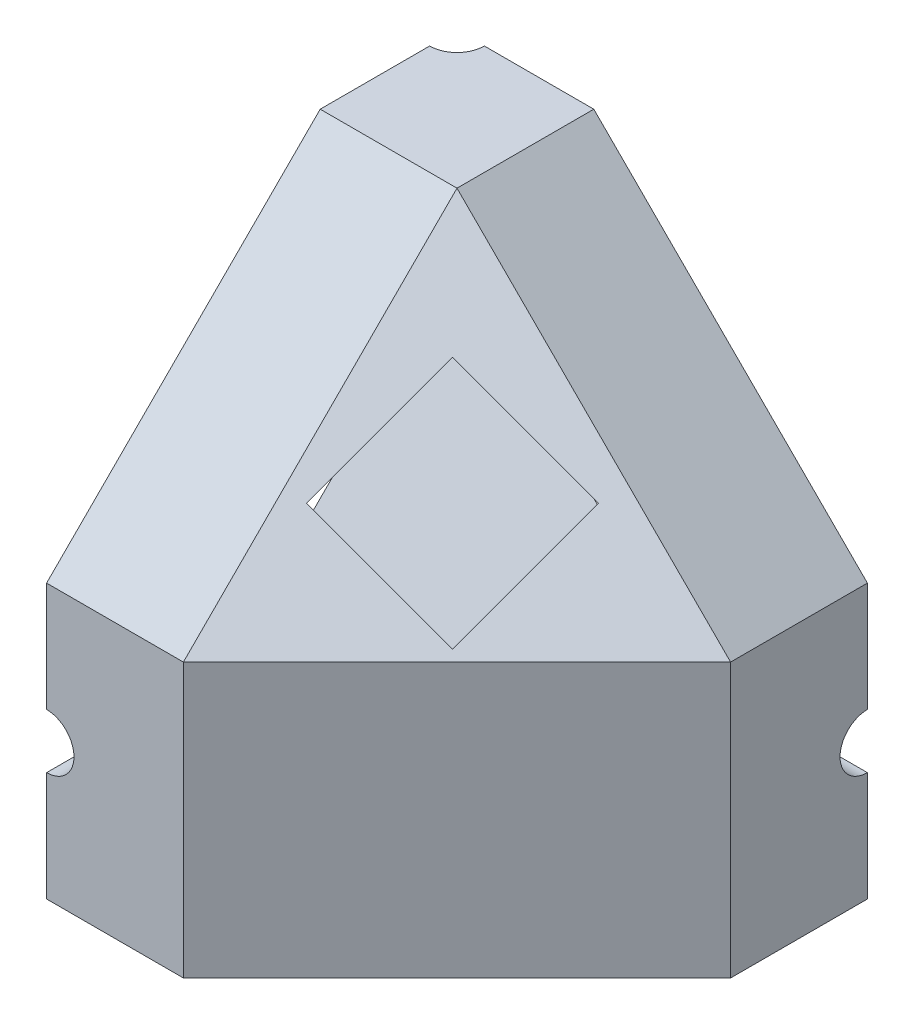
ISO-10303-21;
HEADER;
FILE_DESCRIPTION(('STEP AP214'),'2;1');
FILE_NAME('part.step','',(''),(''),'','','');
FILE_SCHEMA(('AUTOMOTIVE_DESIGN { 1 0 10303 214 1 1 1 1 }'));
ENDSEC;
DATA;
#1=APPLICATION_CONTEXT('core data for automotive mechanical design processes');
#2=APPLICATION_PROTOCOL_DEFINITION('international standard','automotive_design',2000,#1);
#3=PRODUCT_CONTEXT('',#1,'mechanical');
#4=PRODUCT('Part','Part','',(#3));
#5=PRODUCT_RELATED_PRODUCT_CATEGORY('part','',(#4));
#6=PRODUCT_DEFINITION_FORMATION('','',#4);
#7=PRODUCT_DEFINITION_CONTEXT('part definition',#1,'design');
#8=PRODUCT_DEFINITION('design','',#6,#7);
#9=PRODUCT_DEFINITION_SHAPE('','',#8);
#10=(LENGTH_UNIT() NAMED_UNIT(*) SI_UNIT(.MILLI.,.METRE.));
#11=(NAMED_UNIT(*) PLANE_ANGLE_UNIT() SI_UNIT($,.RADIAN.));
#12=(NAMED_UNIT(*) SI_UNIT($,.STERADIAN.) SOLID_ANGLE_UNIT());
#13=UNCERTAINTY_MEASURE_WITH_UNIT(LENGTH_MEASURE(1.E-05),#10,'distance_accuracy_value','');
#14=(GEOMETRIC_REPRESENTATION_CONTEXT(3) GLOBAL_UNCERTAINTY_ASSIGNED_CONTEXT((#13)) GLOBAL_UNIT_ASSIGNED_CONTEXT((#10,
#11,#12)) REPRESENTATION_CONTEXT('',''));
#15=CARTESIAN_POINT('',(0.,0.,0.));
#16=DIRECTION('',(0.,0.,1.));
#17=DIRECTION('',(1.,0.,0.));
#18=AXIS2_PLACEMENT_3D('',#15,#16,#17);
#19=CARTESIAN_POINT('',(30.,15.,0.));
#20=DIRECTION('',(0.,-0.707106781186547,-0.707106781186547));
#21=DIRECTION('',(0.,0.707106781186548,-0.707106781186548));
#22=AXIS2_PLACEMENT_3D('',#19,#20,#21);
#23=PLANE('',#22);
#24=DIRECTION('',(0.,0.707106781186548,-0.707106781186548));
#25=VECTOR('',#24,1.);
#26=CARTESIAN_POINT('',(7.49999999999999,15.,0.));
#27=LINE('',#26,#25);
#28=CARTESIAN_POINT('',(7.49999999999999,15.,0.));
#29=VERTEX_POINT('',#28);
#30=CARTESIAN_POINT('',(7.49999999999999,30.,-15.));
#31=VERTEX_POINT('',#30);
#32=EDGE_CURVE('E349',#29,#31,#27,.T.);
#33=ORIENTED_EDGE('',*,*,#32,.F.);
#34=DIRECTION('',(-1.,0.,0.));
#35=VECTOR('',#34,1.);
#36=CARTESIAN_POINT('',(30.,15.,0.));
#37=LINE('',#36,#35);
#38=CARTESIAN_POINT('',(15.,15.,0.));
#39=VERTEX_POINT('',#38);
#40=EDGE_CURVE('E338',#39,#29,#37,.T.);
#41=ORIENTED_EDGE('',*,*,#40,.F.);
#42=DIRECTION('',(0.,-0.707106781186548,0.707106781186548));
#43=VECTOR('',#42,1.);
#44=CARTESIAN_POINT('',(15.,15.,0.));
#45=LINE('',#44,#43);
#46=CARTESIAN_POINT('',(15.,30.,-15.));
#47=VERTEX_POINT('',#46);
#48=EDGE_CURVE('E312',#47,#39,#45,.T.);
#49=ORIENTED_EDGE('',*,*,#48,.F.);
#50=DIRECTION('',(-1.,0.,0.));
#51=VECTOR('',#50,1.);
#52=CARTESIAN_POINT('',(30.,30.,-15.));
#53=LINE('',#52,#51);
#54=EDGE_CURVE('E335',#47,#31,#53,.T.);
#55=ORIENTED_EDGE('',*,*,#54,.T.);
#56=EDGE_LOOP('',(#33,#41,#49,#55));
#57=FACE_BOUND('',#56,.T.);
#58=ADVANCED_FACE('F71',(#57),#23,.F.);
#59=CARTESIAN_POINT('',(0.,30.,-30.));
#60=DIRECTION('',(0.,1.,0.));
#61=DIRECTION('',(0.,0.,1.));
#62=AXIS2_PLACEMENT_3D('',#59,#60,#61);
#63=PLANE('',#62);
#64=CARTESIAN_POINT('',(7.49999999999999,30.,-22.5));
#65=DIRECTION('',(0.,1.,0.));
#66=DIRECTION('',(0.,0.,1.));
#67=AXIS2_PLACEMENT_3D('',#64,#65,#66);
#68=CIRCLE('',#67,1.5);
#69=CARTESIAN_POINT('',(7.5,30.,-21.));
#70=VERTEX_POINT('',#69);
#71=CARTESIAN_POINT('',(8.99999999999999,30.,-22.5));
#72=VERTEX_POINT('',#71);
#73=EDGE_CURVE('E272',#70,#72,#68,.T.);
#74=ORIENTED_EDGE('',*,*,#73,.F.);
#75=DIRECTION('',(0.,0.,1.));
#76=VECTOR('',#75,1.);
#77=CARTESIAN_POINT('',(7.49999999999999,30.,-30.));
#78=LINE('',#77,#76);
#79=EDGE_CURVE('E356',#70,#31,#78,.T.);
#80=ORIENTED_EDGE('',*,*,#79,.T.);
#81=ORIENTED_EDGE('',*,*,#54,.F.);
#82=DIRECTION('',(0.,0.,1.));
#83=VECTOR('',#82,1.);
#84=CARTESIAN_POINT('',(15.,30.,-30.));
#85=LINE('',#84,#83);
#86=CARTESIAN_POINT('',(15.,30.,-22.5));
#87=VERTEX_POINT('',#86);
#88=EDGE_CURVE('E230',#87,#47,#85,.T.);
#89=ORIENTED_EDGE('',*,*,#88,.F.);
#90=DIRECTION('',(1.,0.,0.));
#91=VECTOR('',#90,1.);
#92=CARTESIAN_POINT('',(5.99999999999999,30.,-22.5));
#93=LINE('',#92,#91);
#94=EDGE_CURVE('E385',#72,#87,#93,.T.);
#95=ORIENTED_EDGE('',*,*,#94,.F.);
#96=EDGE_LOOP('',(#74,#80,#81,#89,#95));
#97=FACE_BOUND('',#96,.T.);
#98=ADVANCED_FACE('F354',(#97),#63,.T.);
#99=CARTESIAN_POINT('',(0.,0.,-30.));
#100=DIRECTION('',(0.,-1.,0.));
#101=DIRECTION('',(0.,0.,-1.));
#102=AXIS2_PLACEMENT_3D('',#99,#100,#101);
#103=PLANE('',#102);
#104=DIRECTION('',(1.,0.,0.));
#105=VECTOR('',#104,1.);
#106=CARTESIAN_POINT('',(0.,0.,0.));
#107=LINE('',#106,#105);
#108=CARTESIAN_POINT('',(7.5,0.,0.));
#109=VERTEX_POINT('',#108);
#110=CARTESIAN_POINT('',(15.,0.,0.));
#111=VERTEX_POINT('',#110);
#112=EDGE_CURVE('E211',#109,#111,#107,.T.);
#113=ORIENTED_EDGE('',*,*,#112,.F.);
#114=DIRECTION('',(0.,0.,1.));
#115=VECTOR('',#114,1.);
#116=CARTESIAN_POINT('',(7.5,0.,0.));
#117=LINE('',#116,#115);
#118=CARTESIAN_POINT('',(7.5,0.,-22.5));
#119=VERTEX_POINT('',#118);
#120=EDGE_CURVE('E197',#119,#109,#117,.T.);
#121=ORIENTED_EDGE('',*,*,#120,.F.);
#122=DIRECTION('',(1.,0.,0.));
#123=VECTOR('',#122,1.);
#124=CARTESIAN_POINT('',(5.99999999999999,0.,-22.5));
#125=LINE('',#124,#123);
#126=CARTESIAN_POINT('',(30.,0.,-22.5));
#127=VERTEX_POINT('',#126);
#128=EDGE_CURVE('E386',#119,#127,#125,.T.);
#129=ORIENTED_EDGE('',*,*,#128,.T.);
#130=DIRECTION('',(0.,0.,1.));
#131=VECTOR('',#130,1.);
#132=CARTESIAN_POINT('',(30.,0.,-30.));
#133=LINE('',#132,#131);
#134=CARTESIAN_POINT('',(30.,0.,-15.));
#135=VERTEX_POINT('',#134);
#136=EDGE_CURVE('E223',#127,#135,#133,.T.);
#137=ORIENTED_EDGE('',*,*,#136,.T.);
#138=DIRECTION('',(0.707106781186547,0.,-0.707106781186547));
#139=VECTOR('',#138,1.);
#140=CARTESIAN_POINT('',(15.,0.,0.));
#141=LINE('',#140,#139);
#142=EDGE_CURVE('E221',#111,#135,#141,.T.);
#143=ORIENTED_EDGE('',*,*,#142,.F.);
#144=EDGE_LOOP('',(#113,#121,#129,#137,#143));
#145=FACE_BOUND('',#144,.T.);
#146=ADVANCED_FACE('F73',(#145),#103,.T.);
#147=CARTESIAN_POINT('',(0.,0.,0.));
#148=DIRECTION('',(0.,0.,-1.));
#149=DIRECTION('',(-1.,0.,0.));
#150=AXIS2_PLACEMENT_3D('',#147,#148,#149);
#151=PLANE('',#150);
#152=DIRECTION('',(0.,1.,0.));
#153=VECTOR('',#152,1.);
#154=CARTESIAN_POINT('',(7.5,0.,0.));
#155=LINE('',#154,#153);
#156=CARTESIAN_POINT('',(7.5,6.,0.));
#157=VERTEX_POINT('',#156);
#158=EDGE_CURVE('E200',#109,#157,#155,.T.);
#159=ORIENTED_EDGE('',*,*,#158,.F.);
#160=ORIENTED_EDGE('',*,*,#112,.T.);
#161=DIRECTION('',(0.,-1.,0.));
#162=VECTOR('',#161,1.);
#163=CARTESIAN_POINT('',(15.,30.,0.));
#164=LINE('',#163,#162);
#165=EDGE_CURVE('E330',#39,#111,#164,.T.);
#166=ORIENTED_EDGE('',*,*,#165,.F.);
#167=ORIENTED_EDGE('',*,*,#40,.T.);
#168=CARTESIAN_POINT('',(7.5,9.,0.));
#169=VERTEX_POINT('',#168);
#170=EDGE_CURVE('E217',#169,#29,#155,.T.);
#171=ORIENTED_EDGE('',*,*,#170,.F.);
#172=CARTESIAN_POINT('',(7.49999999999999,7.5,0.));
#173=DIRECTION('',(0.,0.,1.));
#174=DIRECTION('',(1.,0.,0.));
#175=AXIS2_PLACEMENT_3D('',#172,#173,#174);
#176=CIRCLE('',#175,1.5);
#177=EDGE_CURVE('E215',#157,#169,#176,.T.);
#178=ORIENTED_EDGE('',*,*,#177,.F.);
#179=EDGE_LOOP('',(#159,#160,#166,#167,#171,#178));
#180=FACE_BOUND('',#179,.T.);
#181=ADVANCED_FACE('F209',(#180),#151,.F.);
#182=CARTESIAN_POINT('',(13.5087185190748,6.74799425261948,-16.2374748852274));
#183=DIRECTION('',(-0.211324865405191,-0.577350269189623,0.788675134594814));
#184=DIRECTION('',(0.,-0.806898221355075,-0.59069049456887));
#185=AXIS2_PLACEMENT_3D('',#182,#183,#184);
#186=PLANE('',#185);
#187=DIRECTION('',(0.,-0.806898221355075,-0.59069049456887));
#188=VECTOR('',#187,1.);
#189=CARTESIAN_POINT('',(7.5,7.51537880520136,-17.285741678526));
#190=LINE('',#189,#188);
#191=CARTESIAN_POINT('',(7.5,11.6674789638202,-14.2461934043023));
#192=VERTEX_POINT('',#191);
#193=CARTESIAN_POINT('',(7.49999999999999,11.1466814969623,-14.6274436104954));
#194=VERTEX_POINT('',#193);
#195=EDGE_CURVE('E87',#192,#194,#190,.T.);
#196=ORIENTED_EDGE('',*,*,#195,.F.);
#197=DIRECTION('',(0.577350269189626,0.577350269189626,0.577350269189625));
#198=VECTOR('',#197,1.);
#199=CARTESIAN_POINT('',(7.19931744231632,11.3667964061365,-14.546875961986));
#200=LINE('',#199,#198);
#201=CARTESIAN_POINT('',(15.8595714801607,20.0270504439809,-5.88662192414159));
#202=VERTEX_POINT('',#201);
#203=EDGE_CURVE('E309',#192,#202,#200,.T.);
#204=ORIENTED_EDGE('',*,*,#203,.T.);
#205=DIRECTION('',(0.788675134594812,-0.577350269189629,-0.211324865405183));
#206=VECTOR('',#205,1.);
#207=CARTESIAN_POINT('',(22.1689725569192,15.4082482904639,-7.57722084738306));
#208=LINE('',#207,#206);
#209=CARTESIAN_POINT('',(22.1689725569192,15.4082482904639,-7.57722084738306));
#210=VERTEX_POINT('',#209);
#211=EDGE_CURVE('E277',#202,#210,#208,.T.);
#212=ORIENTED_EDGE('',*,*,#211,.T.);
#213=DIRECTION('',(0.577350269189626,0.577350269189626,0.577350269189625));
#214=VECTOR('',#213,1.);
#215=CARTESIAN_POINT('',(13.5087185190748,6.74799425261948,-16.2374748852274));
#216=LINE('',#215,#214);
#217=CARTESIAN_POINT('',(13.5087185190748,6.74799425261948,-16.2374748852274));
#218=VERTEX_POINT('',#217);
#219=EDGE_CURVE('E295',#218,#210,#216,.T.);
#220=ORIENTED_EDGE('',*,*,#219,.F.);
#221=DIRECTION('',(0.788675134594812,-0.577350269189629,-0.211324865405183));
#222=VECTOR('',#221,1.);
#223=CARTESIAN_POINT('',(13.5087185190748,6.74799425261948,-16.2374748852274));
#224=LINE('',#223,#222);
#225=EDGE_CURVE('E280',#194,#218,#224,.T.);
#226=ORIENTED_EDGE('',*,*,#225,.F.);
#227=EDGE_LOOP('',(#196,#204,#212,#220,#226));
#228=FACE_BOUND('',#227,.T.);
#229=ADVANCED_FACE('F472',(#228),#186,.F.);
#230=CARTESIAN_POINT('',(7.19931744231632,11.3667964061365,-14.546875961986));
#231=DIRECTION('',(-0.788675134594812,0.577350269189629,0.211324865405183));
#232=DIRECTION('',(-0.590690494568875,-0.806898221355071,0.));
#233=AXIS2_PLACEMENT_3D('',#230,#231,#232);
#234=PLANE('',#233);
#235=DIRECTION('',(0.,-0.343723769333433,0.939070801588047));
#236=VECTOR('',#235,1.);
#237=CARTESIAN_POINT('',(7.5,11.7290091167577,-14.414296908325));
#238=LINE('',#237,#236);
#239=CARTESIAN_POINT('',(7.49999999999999,12.188276430678,-15.6690385442112));
#240=VERTEX_POINT('',#239);
#241=EDGE_CURVE('E380',#240,#192,#238,.T.);
#242=ORIENTED_EDGE('',*,*,#241,.F.);
#243=DIRECTION('',(-0.211324865405191,-0.577350269189623,0.788675134594814));
#244=VECTOR('',#243,1.);
#245=CARTESIAN_POINT('',(7.19931744231632,11.3667964061365,-14.546875961986));
#246=LINE('',#245,#244);
#247=CARTESIAN_POINT('',(8.88991636555784,15.9855985596535,-20.8562770387445));
#248=VERTEX_POINT('',#247);
#249=EDGE_CURVE('E291',#248,#240,#246,.T.);
#250=ORIENTED_EDGE('',*,*,#249,.F.);
#251=DIRECTION('',(0.577350269189626,0.577350269189626,0.577350269189625));
#252=VECTOR('',#251,1.);
#253=CARTESIAN_POINT('',(8.88991636555784,15.9855985596535,-20.8562770387445));
#254=LINE('',#253,#252);
#255=CARTESIAN_POINT('',(17.5501704034022,24.6458525974979,-12.1960230009001));
#256=VERTEX_POINT('',#255);
#257=EDGE_CURVE('E313',#248,#256,#254,.T.);
#258=ORIENTED_EDGE('',*,*,#257,.T.);
#259=DIRECTION('',(-0.211324865405191,-0.577350269189623,0.788675134594814));
#260=VECTOR('',#259,1.);
#261=CARTESIAN_POINT('',(15.8595714801607,20.0270504439809,-5.88662192414159));
#262=LINE('',#261,#260);
#263=EDGE_CURVE('E284',#256,#202,#262,.T.);
#264=ORIENTED_EDGE('',*,*,#263,.T.);
#265=ORIENTED_EDGE('',*,*,#203,.F.);
#266=EDGE_LOOP('',(#242,#250,#258,#264,#265));
#267=FACE_BOUND('',#266,.T.);
#268=ADVANCED_FACE('F436',(#267),#234,.F.);
#269=CARTESIAN_POINT('',(1.33974596215563,1.33974596215563,1.33974596215563));
#270=DIRECTION('',(-0.577350269189626,-0.577350269189626,-0.577350269189625));
#271=DIRECTION('',(0.707106781186547,-0.707106781186548,0.));
#272=AXIS2_PLACEMENT_3D('',#269,#270,#271);
#273=PLANE('',#272);
#274=DIRECTION('',(0.,0.707106781186547,-0.707106781186548));
#275=VECTOR('',#274,1.);
#276=CARTESIAN_POINT('',(7.5,-1.74038105676656,-1.74038105676656));
#277=LINE('',#276,#275);
#278=EDGE_CURVE('E377',#194,#240,#277,.T.);
#279=ORIENTED_EDGE('',*,*,#278,.F.);
#280=ORIENTED_EDGE('',*,*,#225,.T.);
#281=DIRECTION('',(0.211324865405191,0.577350269189623,-0.788675134594814));
#282=VECTOR('',#281,1.);
#283=CARTESIAN_POINT('',(15.1993174423163,11.3667964061365,-22.546875961986));
#284=LINE('',#283,#282);
#285=CARTESIAN_POINT('',(15.1867570661578,11.3324808203091,-22.5));
#286=VERTEX_POINT('',#285);
#287=EDGE_CURVE('E283',#218,#286,#284,.T.);
#288=ORIENTED_EDGE('',*,*,#287,.T.);
#289=DIRECTION('',(-0.707106781186547,0.707106781186548,0.));
#290=VECTOR('',#289,1.);
#291=CARTESIAN_POINT('',(13.2596189432334,13.2596189432334,-22.5));
#292=LINE('',#291,#290);
#293=CARTESIAN_POINT('',(15.0243739705311,11.4948639159357,-22.5));
#294=VERTEX_POINT('',#293);
#295=EDGE_CURVE('E408',#286,#294,#292,.T.);
#296=ORIENTED_EDGE('',*,*,#295,.T.);
#297=DIRECTION('',(-0.788675134594811,0.577350269189629,0.211324865405183));
#298=VECTOR('',#297,1.);
#299=CARTESIAN_POINT('',(8.88991636555784,15.9855985596535,-20.8562770387445));
#300=LINE('',#299,#298);
#301=EDGE_CURVE('E288',#294,#248,#300,.T.);
#302=ORIENTED_EDGE('',*,*,#301,.T.);
#303=ORIENTED_EDGE('',*,*,#249,.T.);
#304=EDGE_LOOP('',(#279,#280,#288,#296,#302,#303));
#305=FACE_BOUND('',#304,.T.);
#306=ADVANCED_FACE('F439',(#305),#273,.F.);
#307=CARTESIAN_POINT('',(7.49999999999999,10.,-22.5));
#308=DIRECTION('',(0.,1.,0.));
#309=DIRECTION('',(0.,0.,1.));
#310=AXIS2_PLACEMENT_3D('',#307,#308,#309);
#311=CYLINDRICAL_SURFACE('',#310,1.5);
#312=DIRECTION('',(0.,1.,0.));
#313=VECTOR('',#312,1.);
#314=CARTESIAN_POINT('',(7.5,10.,-21.));
#315=LINE('',#314,#313);
#316=CARTESIAN_POINT('',(7.49999999999999,10.,-21.));
#317=VERTEX_POINT('',#316);
#318=EDGE_CURVE('E359',#70,#317,#315,.F.);
#319=ORIENTED_EDGE('',*,*,#318,.F.);
#320=ORIENTED_EDGE('',*,*,#73,.T.);
#321=DIRECTION('',(0.,1.,0.));
#322=VECTOR('',#321,1.);
#323=CARTESIAN_POINT('',(8.99999999999999,10.,-22.5));
#324=LINE('',#323,#322);
#325=CARTESIAN_POINT('',(8.99999999999999,10.,-22.5));
#326=VERTEX_POINT('',#325);
#327=EDGE_CURVE('E404',#72,#326,#324,.F.);
#328=ORIENTED_EDGE('',*,*,#327,.T.);
#329=CARTESIAN_POINT('',(7.49999999999999,10.,-22.5));
#330=DIRECTION('',(0.,1.,0.));
#331=DIRECTION('',(0.,0.,1.));
#332=AXIS2_PLACEMENT_3D('',#329,#330,#331);
#333=CIRCLE('',#332,1.5);
#334=EDGE_CURVE('E274',#317,#326,#333,.T.);
#335=ORIENTED_EDGE('',*,*,#334,.F.);
#336=EDGE_LOOP('',(#319,#320,#328,#335));
#337=FACE_BOUND('',#336,.T.);
#338=ADVANCED_FACE('F494',(#337),#311,.F.);
#339=CARTESIAN_POINT('',(7.49999999999999,10.,-22.5));
#340=DIRECTION('',(0.,1.,0.));
#341=DIRECTION('',(0.,0.,1.));
#342=AXIS2_PLACEMENT_3D('',#339,#340,#341);
#343=PLANE('',#342);
#344=DIRECTION('',(1.,0.,0.));
#345=VECTOR('',#344,1.);
#346=CARTESIAN_POINT('',(7.49999999999999,10.,-22.5));
#347=LINE('',#346,#345);
#348=CARTESIAN_POINT('',(7.49999999999999,10.,-22.5));
#349=VERTEX_POINT('',#348);
#350=EDGE_CURVE('E400',#349,#326,#347,.T.);
#351=ORIENTED_EDGE('',*,*,#350,.F.);
#352=DIRECTION('',(0.,0.,1.));
#353=VECTOR('',#352,1.);
#354=CARTESIAN_POINT('',(7.49999999999999,10.,-22.5));
#355=LINE('',#354,#353);
#356=EDGE_CURVE('E94',#349,#317,#355,.T.);
#357=ORIENTED_EDGE('',*,*,#356,.T.);
#358=ORIENTED_EDGE('',*,*,#334,.T.);
#359=EDGE_LOOP('',(#351,#357,#358));
#360=FACE_BOUND('',#359,.T.);
#361=ADVANCED_FACE('F491',(#360),#343,.T.);
#362=CARTESIAN_POINT('',(7.49999999999999,7.5,-20.));
#363=DIRECTION('',(0.,0.,1.));
#364=DIRECTION('',(1.,0.,0.));
#365=AXIS2_PLACEMENT_3D('',#362,#363,#364);
#366=CYLINDRICAL_SURFACE('',#365,1.5);
#367=DIRECTION('',(0.,0.,1.));
#368=VECTOR('',#367,1.);
#369=CARTESIAN_POINT('',(7.5,6.,-20.));
#370=LINE('',#369,#368);
#371=CARTESIAN_POINT('',(7.5,6.,-20.));
#372=VERTEX_POINT('',#371);
#373=EDGE_CURVE('E374',#157,#372,#370,.F.);
#374=ORIENTED_EDGE('',*,*,#373,.F.);
#375=ORIENTED_EDGE('',*,*,#177,.T.);
#376=DIRECTION('',(0.,0.,1.));
#377=VECTOR('',#376,1.);
#378=CARTESIAN_POINT('',(7.5,9.,-20.));
#379=LINE('',#378,#377);
#380=CARTESIAN_POINT('',(7.49999999999999,9.,-20.));
#381=VERTEX_POINT('',#380);
#382=EDGE_CURVE('E371',#381,#169,#379,.T.);
#383=ORIENTED_EDGE('',*,*,#382,.F.);
#384=CARTESIAN_POINT('',(7.49999999999999,7.5,-20.));
#385=DIRECTION('',(0.,0.,1.));
#386=DIRECTION('',(1.,0.,0.));
#387=AXIS2_PLACEMENT_3D('',#384,#385,#386);
#388=CIRCLE('',#387,1.5);
#389=EDGE_CURVE('E263',#372,#381,#388,.T.);
#390=ORIENTED_EDGE('',*,*,#389,.F.);
#391=EDGE_LOOP('',(#374,#375,#383,#390));
#392=FACE_BOUND('',#391,.T.);
#393=ADVANCED_FACE('F454',(#392),#366,.F.);
#394=CARTESIAN_POINT('',(7.49999999999999,7.5,-20.));
#395=DIRECTION('',(0.,0.,1.));
#396=DIRECTION('',(1.,0.,0.));
#397=AXIS2_PLACEMENT_3D('',#394,#395,#396);
#398=PLANE('',#397);
#399=ORIENTED_EDGE('',*,*,#389,.T.);
#400=DIRECTION('',(0.,-1.,0.));
#401=VECTOR('',#400,1.);
#402=CARTESIAN_POINT('',(7.49999999999999,7.5,-20.));
#403=LINE('',#402,#401);
#404=EDGE_CURVE('E363',#381,#372,#403,.T.);
#405=ORIENTED_EDGE('',*,*,#404,.T.);
#406=EDGE_LOOP('',(#399,#405));
#407=FACE_BOUND('',#406,.T.);
#408=ADVANCED_FACE('F443',(#407),#398,.T.);
#409=CARTESIAN_POINT('',(5.99999999999999,0.,-22.5));
#410=DIRECTION('',(0.,0.,1.));
#411=DIRECTION('',(1.,0.,0.));
#412=AXIS2_PLACEMENT_3D('',#409,#410,#411);
#413=PLANE('',#412);
#414=CARTESIAN_POINT('',(25.,14.,-22.5));
#415=DIRECTION('',(0.,0.,-1.));
#416=DIRECTION('',(-1.,0.,0.));
#417=AXIS2_PLACEMENT_3D('',#414,#415,#416);
#418=CIRCLE('',#417,1.);
#419=CARTESIAN_POINT('',(24.,14.,-22.5));
#420=VERTEX_POINT('',#419);
#421=EDGE_CURVE('E653',#420,#420,#418,.T.);
#422=ORIENTED_EDGE('',*,*,#421,.F.);
#423=EDGE_LOOP('',(#422));
#424=FACE_BOUND('',#423,.T.);
#425=CARTESIAN_POINT('',(18.,3.,-22.5));
#426=DIRECTION('',(0.,0.,-1.));
#427=DIRECTION('',(-1.,0.,0.));
#428=AXIS2_PLACEMENT_3D('',#425,#426,#427);
#429=CIRCLE('',#428,1.);
#430=CARTESIAN_POINT('',(17.,3.,-22.5));
#431=VERTEX_POINT('',#430);
#432=EDGE_CURVE('E667',#431,#431,#429,.T.);
#433=ORIENTED_EDGE('',*,*,#432,.F.);
#434=EDGE_LOOP('',(#433));
#435=FACE_BOUND('',#434,.T.);
#436=ORIENTED_EDGE('',*,*,#295,.F.);
#437=DIRECTION('',(-0.590690494568875,-0.806898221355071,0.));
#438=VECTOR('',#437,1.);
#439=CARTESIAN_POINT('',(15.2074953115571,11.3608097903545,-22.5));
#440=LINE('',#439,#438);
#441=CARTESIAN_POINT('',(15.2461934043023,11.4136723681224,-22.5));
#442=VERTEX_POINT('',#441);
#443=EDGE_CURVE('E411',#442,#286,#440,.T.);
#444=ORIENTED_EDGE('',*,*,#443,.F.);
#445=DIRECTION('',(0.939070801588041,-0.343723769333448,0.));
#446=VECTOR('',#445,1.);
#447=CARTESIAN_POINT('',(8.16515455575135,14.0055124718766,-22.5));
#448=LINE('',#447,#446);
#449=EDGE_CURVE('E265',#294,#442,#448,.T.);
#450=ORIENTED_EDGE('',*,*,#449,.F.);
#451=EDGE_LOOP('',(#436,#444,#450));
#452=FACE_BOUND('',#451,.T.);
#453=DIRECTION('',(0.,-1.,0.));
#454=VECTOR('',#453,1.);
#455=CARTESIAN_POINT('',(7.5,0.,-22.5));
#456=LINE('',#455,#454);
#457=EDGE_CURVE('E12',#349,#119,#456,.T.);
#458=ORIENTED_EDGE('',*,*,#457,.F.);
#459=ORIENTED_EDGE('',*,*,#350,.T.);
#460=ORIENTED_EDGE('',*,*,#327,.F.);
#461=ORIENTED_EDGE('',*,*,#94,.T.);
#462=DIRECTION('',(-0.707106781186548,0.707106781186547,0.));
#463=VECTOR('',#462,1.);
#464=CARTESIAN_POINT('',(15.,30.,-22.5));
#465=LINE('',#464,#463);
#466=CARTESIAN_POINT('',(30.,15.,-22.5));
#467=VERTEX_POINT('',#466);
#468=EDGE_CURVE('E396',#467,#87,#465,.T.);
#469=ORIENTED_EDGE('',*,*,#468,.F.);
#470=DIRECTION('',(0.,-1.,0.));
#471=VECTOR('',#470,1.);
#472=CARTESIAN_POINT('',(30.,0.,-22.5));
#473=LINE('',#472,#471);
#474=CARTESIAN_POINT('',(30.,9.,-22.5));
#475=VERTEX_POINT('',#474);
#476=EDGE_CURVE('E395',#467,#475,#473,.T.);
#477=ORIENTED_EDGE('',*,*,#476,.T.);
#478=DIRECTION('',(1.,0.,0.));
#479=VECTOR('',#478,1.);
#480=CARTESIAN_POINT('',(9.99999999999999,8.99999999999999,-22.5));
#481=LINE('',#480,#479);
#482=CARTESIAN_POINT('',(9.99999999999999,8.99999999999999,-22.5));
#483=VERTEX_POINT('',#482);
#484=EDGE_CURVE('E245',#483,#475,#481,.T.);
#485=ORIENTED_EDGE('',*,*,#484,.F.);
#486=DIRECTION('',(0.,-1.,0.));
#487=VECTOR('',#486,1.);
#488=CARTESIAN_POINT('',(9.99999999999999,7.49999999999999,-22.5));
#489=LINE('',#488,#487);
#490=CARTESIAN_POINT('',(9.99999999999999,5.99999999999999,-22.5));
#491=VERTEX_POINT('',#490);
#492=EDGE_CURVE('E80',#483,#491,#489,.T.);
#493=ORIENTED_EDGE('',*,*,#492,.T.);
#494=DIRECTION('',(1.,0.,0.));
#495=VECTOR('',#494,1.);
#496=CARTESIAN_POINT('',(9.99999999999999,5.99999999999999,-22.5));
#497=LINE('',#496,#495);
#498=CARTESIAN_POINT('',(30.,6.,-22.5));
#499=VERTEX_POINT('',#498);
#500=EDGE_CURVE('E242',#499,#491,#497,.F.);
#501=ORIENTED_EDGE('',*,*,#500,.F.);
#502=EDGE_CURVE('E256',#499,#127,#473,.T.);
#503=ORIENTED_EDGE('',*,*,#502,.T.);
#504=ORIENTED_EDGE('',*,*,#128,.F.);
#505=EDGE_LOOP('',(#458,#459,#460,#461,#469,#477,#485,#493,#501,#503,#504));
#506=FACE_BOUND('',#505,.T.);
#507=ADVANCED_FACE('F240',(#424,#435,#452,#506),#413,.F.);
#508=CARTESIAN_POINT('',(15.,30.,-30.));
#509=DIRECTION('',(-0.707106781186547,-0.707106781186548,0.));
#510=DIRECTION('',(0.707106781186548,-0.707106781186547,0.));
#511=AXIS2_PLACEMENT_3D('',#508,#509,#510);
#512=PLANE('',#511);
#513=DIRECTION('',(0.,0.,1.));
#514=VECTOR('',#513,1.);
#515=CARTESIAN_POINT('',(30.,15.,-30.));
#516=LINE('',#515,#514);
#517=CARTESIAN_POINT('',(30.,15.,-15.));
#518=VERTEX_POINT('',#517);
#519=EDGE_CURVE('E224',#467,#518,#516,.T.);
#520=ORIENTED_EDGE('',*,*,#519,.F.);
#521=ORIENTED_EDGE('',*,*,#468,.T.);
#522=ORIENTED_EDGE('',*,*,#88,.T.);
#523=DIRECTION('',(-0.707106781186548,0.707106781186547,0.));
#524=VECTOR('',#523,1.);
#525=CARTESIAN_POINT('',(15.,30.,-15.));
#526=LINE('',#525,#524);
#527=EDGE_CURVE('E324',#518,#47,#526,.T.);
#528=ORIENTED_EDGE('',*,*,#527,.F.);
#529=EDGE_LOOP('',(#520,#521,#522,#528));
#530=FACE_BOUND('',#529,.T.);
#531=ADVANCED_FACE('F442',(#530),#512,.F.);
#532=CARTESIAN_POINT('',(15.,30.,0.));
#533=DIRECTION('',(-0.707106781186547,0.,-0.707106781186547));
#534=DIRECTION('',(-0.707106781186548,0.,0.707106781186548));
#535=AXIS2_PLACEMENT_3D('',#532,#533,#534);
#536=PLANE('',#535);
#537=DIRECTION('',(0.707106781186548,0.,-0.707106781186548));
#538=VECTOR('',#537,1.);
#539=CARTESIAN_POINT('',(15.,15.,0.));
#540=LINE('',#539,#538);
#541=EDGE_CURVE('E228',#39,#518,#540,.T.);
#542=ORIENTED_EDGE('',*,*,#541,.F.);
#543=ORIENTED_EDGE('',*,*,#165,.T.);
#544=ORIENTED_EDGE('',*,*,#142,.T.);
#545=DIRECTION('',(0.,-1.,0.));
#546=VECTOR('',#545,1.);
#547=CARTESIAN_POINT('',(30.,30.,-15.));
#548=LINE('',#547,#546);
#549=EDGE_CURVE('E331',#518,#135,#548,.T.);
#550=ORIENTED_EDGE('',*,*,#549,.F.);
#551=EDGE_LOOP('',(#542,#543,#544,#550));
#552=FACE_BOUND('',#551,.T.);
#553=ADVANCED_FACE('F451',(#552),#536,.F.);
#554=CARTESIAN_POINT('',(30.,0.,-30.));
#555=DIRECTION('',(1.,0.,0.));
#556=DIRECTION('',(0.,1.,0.));
#557=AXIS2_PLACEMENT_3D('',#554,#555,#556);
#558=PLANE('',#557);
#559=ORIENTED_EDGE('',*,*,#476,.F.);
#560=ORIENTED_EDGE('',*,*,#519,.T.);
#561=ORIENTED_EDGE('',*,*,#549,.T.);
#562=ORIENTED_EDGE('',*,*,#136,.F.);
#563=ORIENTED_EDGE('',*,*,#502,.F.);
#564=CARTESIAN_POINT('',(30.,7.5,-22.5));
#565=DIRECTION('',(1.,0.,0.));
#566=DIRECTION('',(0.,1.,0.));
#567=AXIS2_PLACEMENT_3D('',#564,#565,#566);
#568=CIRCLE('',#567,1.5);
#569=EDGE_CURVE('E254',#475,#499,#568,.T.);
#570=ORIENTED_EDGE('',*,*,#569,.F.);
#571=EDGE_LOOP('',(#559,#560,#561,#562,#563,#570));
#572=FACE_BOUND('',#571,.T.);
#573=ADVANCED_FACE('F473',(#572),#558,.T.);
#574=CARTESIAN_POINT('',(33.9969093541148,3.5700475177221,-7.56695687183688));
#575=DIRECTION('',(0.577350269189626,0.577350269189626,0.577350269189625));
#576=DIRECTION('',(-0.707106781186547,0.707106781186548,0.));
#577=AXIS2_PLACEMENT_3D('',#574,#575,#576);
#578=PLANE('',#577);
#579=ORIENTED_EDGE('',*,*,#211,.F.);
#580=ORIENTED_EDGE('',*,*,#263,.F.);
#581=DIRECTION('',(-0.788675134594811,0.577350269189629,0.211324865405183));
#582=VECTOR('',#581,1.);
#583=CARTESIAN_POINT('',(17.5501704034022,24.6458525974979,-12.1960230009001));
#584=LINE('',#583,#582);
#585=CARTESIAN_POINT('',(23.8595714801607,20.0270504439808,-13.8866219241416));
#586=VERTEX_POINT('',#585);
#587=EDGE_CURVE('E302',#586,#256,#584,.T.);
#588=ORIENTED_EDGE('',*,*,#587,.F.);
#589=DIRECTION('',(0.211324865405191,0.577350269189623,-0.788675134594814));
#590=VECTOR('',#589,1.);
#591=CARTESIAN_POINT('',(23.8595714801607,20.0270504439808,-13.8866219241416));
#592=LINE('',#591,#590);
#593=EDGE_CURVE('E298',#210,#586,#592,.T.);
#594=ORIENTED_EDGE('',*,*,#593,.F.);
#595=EDGE_LOOP('',(#579,#580,#588,#594));
#596=FACE_BOUND('',#595,.T.);
#597=ORIENTED_EDGE('',*,*,#527,.T.);
#598=ORIENTED_EDGE('',*,*,#48,.T.);
#599=ORIENTED_EDGE('',*,*,#541,.T.);
#600=EDGE_LOOP('',(#597,#598,#599));
#601=FACE_BOUND('',#600,.T.);
#602=ADVANCED_FACE('F431',(#596,#601),#578,.T.);
#603=CARTESIAN_POINT('',(8.88991636555784,15.9855985596535,-20.8562770387445));
#604=DIRECTION('',(0.211324865405191,0.577350269189622,-0.788675134594814));
#605=DIRECTION('',(0.,0.806898221355076,0.590690494568869));
#606=AXIS2_PLACEMENT_3D('',#603,#604,#605);
#607=PLANE('',#606);
#608=ORIENTED_EDGE('',*,*,#301,.F.);
#609=ORIENTED_EDGE('',*,*,#449,.T.);
#610=DIRECTION('',(0.577350269189626,0.577350269189626,0.577350269189625));
#611=VECTOR('',#610,1.);
#612=CARTESIAN_POINT('',(15.1993174423163,11.3667964061365,-22.546875961986));
#613=LINE('',#612,#611);
#614=EDGE_CURVE('E316',#442,#586,#613,.T.);
#615=ORIENTED_EDGE('',*,*,#614,.T.);
#616=ORIENTED_EDGE('',*,*,#587,.T.);
#617=ORIENTED_EDGE('',*,*,#257,.F.);
#618=EDGE_LOOP('',(#608,#609,#615,#616,#617));
#619=FACE_BOUND('',#618,.T.);
#620=ADVANCED_FACE('F421',(#619),#607,.F.);
#621=CARTESIAN_POINT('',(15.1993174423163,11.3667964061365,-22.546875961986));
#622=DIRECTION('',(0.788675134594812,-0.577350269189629,-0.211324865405183));
#623=DIRECTION('',(0.590690494568875,0.806898221355071,0.));
#624=AXIS2_PLACEMENT_3D('',#621,#622,#623);
#625=PLANE('',#624);
#626=ORIENTED_EDGE('',*,*,#614,.F.);
#627=ORIENTED_EDGE('',*,*,#443,.T.);
#628=ORIENTED_EDGE('',*,*,#287,.F.);
#629=ORIENTED_EDGE('',*,*,#219,.T.);
#630=ORIENTED_EDGE('',*,*,#593,.T.);
#631=EDGE_LOOP('',(#626,#627,#628,#629,#630));
#632=FACE_BOUND('',#631,.T.);
#633=ADVANCED_FACE('F424',(#632),#625,.F.);
#634=CARTESIAN_POINT('',(9.99999999999999,7.49999999999999,-22.5));
#635=DIRECTION('',(1.,0.,0.));
#636=DIRECTION('',(0.,1.,0.));
#637=AXIS2_PLACEMENT_3D('',#634,#635,#636);
#638=CYLINDRICAL_SURFACE('',#637,1.5);
#639=ORIENTED_EDGE('',*,*,#569,.T.);
#640=ORIENTED_EDGE('',*,*,#500,.T.);
#641=CARTESIAN_POINT('',(9.99999999999999,7.49999999999999,-22.5));
#642=DIRECTION('',(1.,0.,0.));
#643=DIRECTION('',(0.,1.,0.));
#644=AXIS2_PLACEMENT_3D('',#641,#642,#643);
#645=CIRCLE('',#644,1.5);
#646=EDGE_CURVE('E252',#483,#491,#645,.T.);
#647=ORIENTED_EDGE('',*,*,#646,.F.);
#648=ORIENTED_EDGE('',*,*,#484,.T.);
#649=EDGE_LOOP('',(#639,#640,#647,#648));
#650=FACE_BOUND('',#649,.T.);
#651=ADVANCED_FACE('F251',(#650),#638,.F.);
#652=CARTESIAN_POINT('',(9.99999999999999,7.49999999999999,-22.5));
#653=DIRECTION('',(1.,0.,0.));
#654=DIRECTION('',(0.,1.,0.));
#655=AXIS2_PLACEMENT_3D('',#652,#653,#654);
#656=PLANE('',#655);
#657=ORIENTED_EDGE('',*,*,#492,.F.);
#658=ORIENTED_EDGE('',*,*,#646,.T.);
#659=EDGE_LOOP('',(#657,#658));
#660=FACE_BOUND('',#659,.T.);
#661=ADVANCED_FACE('F258',(#660),#656,.T.);
#662=CARTESIAN_POINT('',(7.5,0.,0.));
#663=DIRECTION('',(-1.,0.,0.));
#664=DIRECTION('',(0.,-1.,0.));
#665=AXIS2_PLACEMENT_3D('',#662,#663,#664);
#666=PLANE('',#665);
#667=CARTESIAN_POINT('',(7.49999999999999,24.,-17.5));
#668=DIRECTION('',(-1.,0.,0.));
#669=DIRECTION('',(0.,-1.,0.));
#670=AXIS2_PLACEMENT_3D('',#667,#668,#669);
#671=CIRCLE('',#670,1.);
#672=CARTESIAN_POINT('',(7.49999999999999,23.,-17.5));
#673=VERTEX_POINT('',#672);
#674=EDGE_CURVE('E675',#673,#673,#671,.T.);
#675=ORIENTED_EDGE('',*,*,#674,.F.);
#676=EDGE_LOOP('',(#675));
#677=FACE_BOUND('',#676,.T.);
#678=CARTESIAN_POINT('',(7.5,3.,-6.));
#679=DIRECTION('',(-1.,0.,0.));
#680=DIRECTION('',(0.,-1.,0.));
#681=AXIS2_PLACEMENT_3D('',#678,#679,#680);
#682=CIRCLE('',#681,1.);
#683=CARTESIAN_POINT('',(7.5,2.,-6.));
#684=VERTEX_POINT('',#683);
#685=EDGE_CURVE('E652',#684,#684,#682,.T.);
#686=ORIENTED_EDGE('',*,*,#685,.F.);
#687=EDGE_LOOP('',(#686));
#688=FACE_BOUND('',#687,.T.);
#689=ORIENTED_EDGE('',*,*,#373,.T.);
#690=ORIENTED_EDGE('',*,*,#404,.F.);
#691=ORIENTED_EDGE('',*,*,#382,.T.);
#692=ORIENTED_EDGE('',*,*,#170,.T.);
#693=ORIENTED_EDGE('',*,*,#32,.T.);
#694=ORIENTED_EDGE('',*,*,#79,.F.);
#695=ORIENTED_EDGE('',*,*,#318,.T.);
#696=ORIENTED_EDGE('',*,*,#356,.F.);
#697=ORIENTED_EDGE('',*,*,#457,.T.);
#698=ORIENTED_EDGE('',*,*,#120,.T.);
#699=ORIENTED_EDGE('',*,*,#158,.T.);
#700=EDGE_LOOP('',(#689,#690,#691,#692,#693,#694,#695,#696,#697,#698,#699));
#701=FACE_BOUND('',#700,.T.);
#702=ORIENTED_EDGE('',*,*,#195,.T.);
#703=ORIENTED_EDGE('',*,*,#278,.T.);
#704=ORIENTED_EDGE('',*,*,#241,.T.);
#705=EDGE_LOOP('',(#702,#703,#704));
#706=FACE_BOUND('',#705,.T.);
#707=ADVANCED_FACE('F199',(#677,#688,#701,#706),#666,.T.);
#708=CARTESIAN_POINT('',(17.5,3.00000000000001,-6.));
#709=DIRECTION('',(-1.,0.,0.));
#710=DIRECTION('',(0.,-1.,0.));
#711=AXIS2_PLACEMENT_3D('',#708,#709,#710);
#712=CYLINDRICAL_SURFACE('',#711,1.);
#713=CARTESIAN_POINT('',(17.5,3.00000000000001,-6.));
#714=DIRECTION('',(-1.,0.,0.));
#715=DIRECTION('',(0.,-1.,0.));
#716=AXIS2_PLACEMENT_3D('',#713,#714,#715);
#717=CIRCLE('',#716,1.);
#718=CARTESIAN_POINT('',(17.5,2.00000000000001,-6.));
#719=VERTEX_POINT('',#718);
#720=EDGE_CURVE('E658',#719,#719,#717,.T.);
#721=ORIENTED_EDGE('',*,*,#720,.F.);
#722=EDGE_LOOP('',(#721));
#723=FACE_BOUND('',#722,.T.);
#724=ORIENTED_EDGE('',*,*,#685,.T.);
#725=EDGE_LOOP('',(#724));
#726=FACE_BOUND('',#725,.T.);
#727=ADVANCED_FACE('F560',(#723,#726),#712,.F.);
#728=CARTESIAN_POINT('',(17.5,3.00000000000001,-6.));
#729=DIRECTION('',(-1.,0.,0.));
#730=DIRECTION('',(0.,-1.,0.));
#731=AXIS2_PLACEMENT_3D('',#728,#729,#730);
#732=PLANE('',#731);
#733=ORIENTED_EDGE('',*,*,#720,.T.);
#734=EDGE_LOOP('',(#733));
#735=FACE_BOUND('',#734,.T.);
#736=ADVANCED_FACE('F570',(#735),#732,.T.);
#737=CARTESIAN_POINT('',(17.5,24.,-17.5));
#738=DIRECTION('',(-1.,0.,0.));
#739=DIRECTION('',(0.,-1.,0.));
#740=AXIS2_PLACEMENT_3D('',#737,#738,#739);
#741=CYLINDRICAL_SURFACE('',#740,1.);
#742=CARTESIAN_POINT('',(17.5,24.,-17.5));
#743=DIRECTION('',(-1.,0.,0.));
#744=DIRECTION('',(0.,-1.,0.));
#745=AXIS2_PLACEMENT_3D('',#742,#743,#744);
#746=CIRCLE('',#745,1.);
#747=CARTESIAN_POINT('',(17.5,23.,-17.5));
#748=VERTEX_POINT('',#747);
#749=EDGE_CURVE('E671',#748,#748,#746,.T.);
#750=ORIENTED_EDGE('',*,*,#749,.F.);
#751=EDGE_LOOP('',(#750));
#752=FACE_BOUND('',#751,.T.);
#753=ORIENTED_EDGE('',*,*,#674,.T.);
#754=EDGE_LOOP('',(#753));
#755=FACE_BOUND('',#754,.T.);
#756=ADVANCED_FACE('F580',(#752,#755),#741,.F.);
#757=CARTESIAN_POINT('',(17.5,24.,-17.5));
#758=DIRECTION('',(-1.,0.,0.));
#759=DIRECTION('',(0.,-1.,0.));
#760=AXIS2_PLACEMENT_3D('',#757,#758,#759);
#761=PLANE('',#760);
#762=ORIENTED_EDGE('',*,*,#749,.T.);
#763=EDGE_LOOP('',(#762));
#764=FACE_BOUND('',#763,.T.);
#765=ADVANCED_FACE('F590',(#764),#761,.T.);
#766=CARTESIAN_POINT('',(18.,3.,-12.5));
#767=DIRECTION('',(0.,0.,-1.));
#768=DIRECTION('',(-1.,0.,0.));
#769=AXIS2_PLACEMENT_3D('',#766,#767,#768);
#770=CYLINDRICAL_SURFACE('',#769,1.);
#771=CARTESIAN_POINT('',(18.,3.,-12.5));
#772=DIRECTION('',(0.,0.,-1.));
#773=DIRECTION('',(-1.,0.,0.));
#774=AXIS2_PLACEMENT_3D('',#771,#772,#773);
#775=CIRCLE('',#774,1.);
#776=CARTESIAN_POINT('',(17.,3.,-12.5));
#777=VERTEX_POINT('',#776);
#778=EDGE_CURVE('E661',#777,#777,#775,.T.);
#779=ORIENTED_EDGE('',*,*,#778,.F.);
#780=EDGE_LOOP('',(#779));
#781=FACE_BOUND('',#780,.T.);
#782=ORIENTED_EDGE('',*,*,#432,.T.);
#783=EDGE_LOOP('',(#782));
#784=FACE_BOUND('',#783,.T.);
#785=ADVANCED_FACE('F599',(#781,#784),#770,.F.);
#786=CARTESIAN_POINT('',(18.,3.,-12.5));
#787=DIRECTION('',(0.,0.,-1.));
#788=DIRECTION('',(-1.,0.,0.));
#789=AXIS2_PLACEMENT_3D('',#786,#787,#788);
#790=PLANE('',#789);
#791=ORIENTED_EDGE('',*,*,#778,.T.);
#792=EDGE_LOOP('',(#791));
#793=FACE_BOUND('',#792,.T.);
#794=ADVANCED_FACE('F614',(#793),#790,.T.);
#795=CARTESIAN_POINT('',(25.,14.,-12.5));
#796=DIRECTION('',(0.,0.,-1.));
#797=DIRECTION('',(-1.,0.,0.));
#798=AXIS2_PLACEMENT_3D('',#795,#796,#797);
#799=CYLINDRICAL_SURFACE('',#798,1.);
#800=CARTESIAN_POINT('',(25.,14.,-12.5));
#801=DIRECTION('',(0.,0.,-1.));
#802=DIRECTION('',(-1.,0.,0.));
#803=AXIS2_PLACEMENT_3D('',#800,#801,#802);
#804=CIRCLE('',#803,1.);
#805=CARTESIAN_POINT('',(24.,14.,-12.5));
#806=VERTEX_POINT('',#805);
#807=EDGE_CURVE('E650',#806,#806,#804,.T.);
#808=ORIENTED_EDGE('',*,*,#807,.F.);
#809=EDGE_LOOP('',(#808));
#810=FACE_BOUND('',#809,.T.);
#811=ORIENTED_EDGE('',*,*,#421,.T.);
#812=EDGE_LOOP('',(#811));
#813=FACE_BOUND('',#812,.T.);
#814=ADVANCED_FACE('F624',(#810,#813),#799,.F.);
#815=CARTESIAN_POINT('',(25.,14.,-12.5));
#816=DIRECTION('',(0.,0.,-1.));
#817=DIRECTION('',(-1.,0.,0.));
#818=AXIS2_PLACEMENT_3D('',#815,#816,#817);
#819=PLANE('',#818);
#820=ORIENTED_EDGE('',*,*,#807,.T.);
#821=EDGE_LOOP('',(#820));
#822=FACE_BOUND('',#821,.T.);
#823=ADVANCED_FACE('F634',(#822),#819,.T.);
#824=CLOSED_SHELL('',(#58,#98,#146,#181,#229,#268,#306,#338,#361,#393,#408,#507,#531,#553,#573,
#602,#620,#633,#651,#661,#707,#727,#736,#756,#765,#785,#794,#814,#823));
#825=MANIFOLD_SOLID_BREP('B2',#824);
#826=ADVANCED_BREP_SHAPE_REPRESENTATION('',(#18,#825),#14);
#827=SHAPE_DEFINITION_REPRESENTATION(#9,#826);
ENDSEC;
END-ISO-10303-21;
